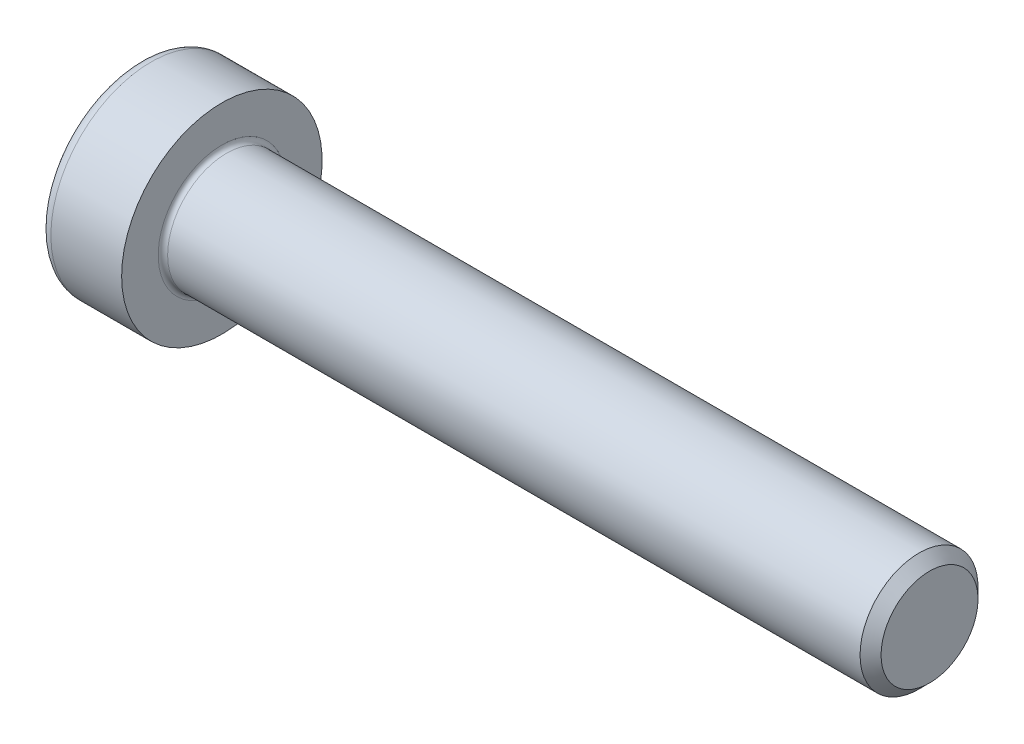
ISO-10303-21;
HEADER;
FILE_DESCRIPTION(('STEP AP214'),'2;1');
FILE_NAME('part.step','',(''),(''),'','','');
FILE_SCHEMA(('AUTOMOTIVE_DESIGN { 1 0 10303 214 1 1 1 1 }'));
ENDSEC;
DATA;
#1=APPLICATION_CONTEXT('core data for automotive mechanical design processes');
#2=APPLICATION_PROTOCOL_DEFINITION('international standard','automotive_design',2000,#1);
#3=PRODUCT_CONTEXT('',#1,'mechanical');
#4=PRODUCT('Part','Part','',(#3));
#5=PRODUCT_RELATED_PRODUCT_CATEGORY('part','',(#4));
#6=PRODUCT_DEFINITION_FORMATION('','',#4);
#7=PRODUCT_DEFINITION_CONTEXT('part definition',#1,'design');
#8=PRODUCT_DEFINITION('design','',#6,#7);
#9=PRODUCT_DEFINITION_SHAPE('','',#8);
#10=(LENGTH_UNIT() NAMED_UNIT(*) SI_UNIT(.MILLI.,.METRE.));
#11=(NAMED_UNIT(*) PLANE_ANGLE_UNIT() SI_UNIT($,.RADIAN.));
#12=(NAMED_UNIT(*) SI_UNIT($,.STERADIAN.) SOLID_ANGLE_UNIT());
#13=UNCERTAINTY_MEASURE_WITH_UNIT(LENGTH_MEASURE(1.E-05),#10,'distance_accuracy_value','');
#14=(GEOMETRIC_REPRESENTATION_CONTEXT(3) GLOBAL_UNCERTAINTY_ASSIGNED_CONTEXT((#13)) GLOBAL_UNIT_ASSIGNED_CONTEXT((#10,
#11,#12)) REPRESENTATION_CONTEXT('',''));
#15=CARTESIAN_POINT('',(0.,0.,0.));
#16=DIRECTION('',(0.,0.,1.));
#17=DIRECTION('',(1.,0.,0.));
#18=AXIS2_PLACEMENT_3D('',#15,#16,#17);
#19=CARTESIAN_POINT('',(2.,3.46410161513776,-2.00000000000001));
#20=DIRECTION('',(1.,0.,0.));
#21=DIRECTION('',(0.,0.,-1.));
#22=AXIS2_PLACEMENT_3D('',#19,#20,#21);
#23=PLANE('',#22);
#24=DIRECTION('',(0.,-1.,0.));
#25=VECTOR('',#24,1.);
#26=CARTESIAN_POINT('',(2.,1.15470053837926,-2.00000000000001));
#27=LINE('',#26,#25);
#28=CARTESIAN_POINT('',(2.,1.15470053837926,-2.00000000000001));
#29=VERTEX_POINT('',#28);
#30=CARTESIAN_POINT('',(2.,0.,-2.00000000000001));
#31=VERTEX_POINT('',#30);
#32=EDGE_CURVE('E140',#29,#31,#27,.T.);
#33=ORIENTED_EDGE('',*,*,#32,.T.);
#34=CARTESIAN_POINT('',(2.,0.,0.));
#35=DIRECTION('',(1.,0.,0.));
#36=DIRECTION('',(0.,0.,-1.));
#37=AXIS2_PLACEMENT_3D('',#34,#35,#36);
#38=CIRCLE('',#37,2.);
#39=CARTESIAN_POINT('',(2.,1.73205080756888,-1.));
#40=VERTEX_POINT('',#39);
#41=EDGE_CURVE('E11',#31,#40,#38,.T.);
#42=ORIENTED_EDGE('',*,*,#41,.T.);
#43=DIRECTION('',(0.,-0.500000000000001,-0.866025403784438));
#44=VECTOR('',#43,1.);
#45=CARTESIAN_POINT('',(2.,2.30940107675851,0.));
#46=LINE('',#45,#44);
#47=EDGE_CURVE('E143',#40,#29,#46,.T.);
#48=ORIENTED_EDGE('',*,*,#47,.T.);
#49=EDGE_LOOP('',(#33,#42,#48));
#50=FACE_BOUND('',#49,.T.);
#51=ADVANCED_FACE('F36',(#50),#23,.F.);
#52=CARTESIAN_POINT('',(2.,2.30940107675851,0.));
#53=VERTEX_POINT('',#52);
#54=EDGE_CURVE('E144',#53,#40,#46,.T.);
#55=ORIENTED_EDGE('',*,*,#54,.T.);
#56=CARTESIAN_POINT('',(2.,1.73205080756888,0.999999999999996));
#57=VERTEX_POINT('',#56);
#58=EDGE_CURVE('E45',#40,#57,#38,.T.);
#59=ORIENTED_EDGE('',*,*,#58,.T.);
#60=DIRECTION('',(0.,-0.499999999999998,0.86602540378444));
#61=VECTOR('',#60,1.);
#62=CARTESIAN_POINT('',(2.,2.30940107675851,0.));
#63=LINE('',#62,#61);
#64=EDGE_CURVE('E123',#53,#57,#63,.T.);
#65=ORIENTED_EDGE('',*,*,#64,.F.);
#66=EDGE_LOOP('',(#55,#59,#65));
#67=FACE_BOUND('',#66,.T.);
#68=ADVANCED_FACE('F213',(#67),#23,.F.);
#69=CARTESIAN_POINT('',(2.,1.15470053837926,1.99999999999999));
#70=VERTEX_POINT('',#69);
#71=EDGE_CURVE('E127',#57,#70,#63,.T.);
#72=ORIENTED_EDGE('',*,*,#71,.F.);
#73=CARTESIAN_POINT('',(2.,0.,0.));
#74=DIRECTION('',(-1.,0.,0.));
#75=DIRECTION('',(0.,0.,1.));
#76=AXIS2_PLACEMENT_3D('',#73,#74,#75);
#77=CIRCLE('',#76,2.);
#78=CARTESIAN_POINT('',(2.,0.,2.));
#79=VERTEX_POINT('',#78);
#80=EDGE_CURVE('E119',#79,#57,#77,.T.);
#81=ORIENTED_EDGE('',*,*,#80,.F.);
#82=DIRECTION('',(0.,1.,0.));
#83=VECTOR('',#82,1.);
#84=CARTESIAN_POINT('',(2.,-1.15470053837924,2.));
#85=LINE('',#84,#83);
#86=EDGE_CURVE('E126',#79,#70,#85,.T.);
#87=ORIENTED_EDGE('',*,*,#86,.T.);
#88=EDGE_LOOP('',(#72,#81,#87));
#89=FACE_BOUND('',#88,.T.);
#90=ADVANCED_FACE('F218',(#89),#23,.F.);
#91=CARTESIAN_POINT('',(2.,-1.15470053837924,2.));
#92=VERTEX_POINT('',#91);
#93=EDGE_CURVE('E128',#92,#79,#85,.T.);
#94=ORIENTED_EDGE('',*,*,#93,.T.);
#95=CARTESIAN_POINT('',(2.,-1.73205080756888,1.));
#96=VERTEX_POINT('',#95);
#97=EDGE_CURVE('E202',#79,#96,#38,.T.);
#98=ORIENTED_EDGE('',*,*,#97,.T.);
#99=DIRECTION('',(0.,-0.500000000000001,-0.866025403784438));
#100=VECTOR('',#99,1.);
#101=CARTESIAN_POINT('',(2.,-1.15470053837924,2.));
#102=LINE('',#101,#100);
#103=EDGE_CURVE('E132',#92,#96,#102,.T.);
#104=ORIENTED_EDGE('',*,*,#103,.F.);
#105=EDGE_LOOP('',(#94,#98,#104));
#106=FACE_BOUND('',#105,.T.);
#107=ADVANCED_FACE('F257',(#106),#23,.F.);
#108=CARTESIAN_POINT('',(2.,-2.30940107675849,0.));
#109=VERTEX_POINT('',#108);
#110=EDGE_CURVE('E131',#96,#109,#102,.T.);
#111=ORIENTED_EDGE('',*,*,#110,.F.);
#112=CARTESIAN_POINT('',(2.,-1.73205080756888,-0.999999999999996));
#113=VERTEX_POINT('',#112);
#114=EDGE_CURVE('E196',#96,#113,#38,.T.);
#115=ORIENTED_EDGE('',*,*,#114,.T.);
#116=DIRECTION('',(0.,0.499999999999998,-0.86602540378444));
#117=VECTOR('',#116,1.);
#118=CARTESIAN_POINT('',(2.,-2.30940107675849,0.));
#119=LINE('',#118,#117);
#120=EDGE_CURVE('E136',#109,#113,#119,.T.);
#121=ORIENTED_EDGE('',*,*,#120,.F.);
#122=EDGE_LOOP('',(#111,#115,#121));
#123=FACE_BOUND('',#122,.T.);
#124=ADVANCED_FACE('F250',(#123),#23,.F.);
#125=CARTESIAN_POINT('',(0.,0.,0.));
#126=DIRECTION('',(-1.,0.,0.));
#127=DIRECTION('',(0.,0.,1.));
#128=AXIS2_PLACEMENT_3D('',#125,#126,#127);
#129=PLANE('',#128);
#130=CARTESIAN_POINT('',(0.,0.,0.));
#131=DIRECTION('',(-1.,0.,0.));
#132=DIRECTION('',(0.,0.,1.));
#133=AXIS2_PLACEMENT_3D('',#130,#131,#132);
#134=CIRCLE('',#133,3.75);
#135=CARTESIAN_POINT('',(0.,0.,3.75));
#136=VERTEX_POINT('',#135);
#137=EDGE_CURVE('E190',#136,#136,#134,.T.);
#138=ORIENTED_EDGE('',*,*,#137,.T.);
#139=EDGE_LOOP('',(#138));
#140=FACE_BOUND('',#139,.T.);
#141=DIRECTION('',(0.,-0.500000000000001,-0.866025403784438));
#142=VECTOR('',#141,1.);
#143=CARTESIAN_POINT('',(0.,2.30940107675851,0.));
#144=LINE('',#143,#142);
#145=CARTESIAN_POINT('',(0.,2.30940107675851,0.));
#146=VERTEX_POINT('',#145);
#147=CARTESIAN_POINT('',(0.,1.15470053837926,-2.00000000000001));
#148=VERTEX_POINT('',#147);
#149=EDGE_CURVE('E159',#146,#148,#144,.T.);
#150=ORIENTED_EDGE('',*,*,#149,.F.);
#151=DIRECTION('',(0.,-0.499999999999998,0.86602540378444));
#152=VECTOR('',#151,1.);
#153=CARTESIAN_POINT('',(0.,2.30940107675851,0.));
#154=LINE('',#153,#152);
#155=CARTESIAN_POINT('',(0.,1.15470053837926,1.99999999999999));
#156=VERTEX_POINT('',#155);
#157=EDGE_CURVE('E58',#146,#156,#154,.T.);
#158=ORIENTED_EDGE('',*,*,#157,.T.);
#159=DIRECTION('',(0.,1.,0.));
#160=VECTOR('',#159,1.);
#161=CARTESIAN_POINT('',(0.,-1.15470053837924,2.));
#162=LINE('',#161,#160);
#163=CARTESIAN_POINT('',(0.,-1.15470053837924,2.));
#164=VERTEX_POINT('',#163);
#165=EDGE_CURVE('E149',#164,#156,#162,.T.);
#166=ORIENTED_EDGE('',*,*,#165,.F.);
#167=DIRECTION('',(0.,-0.500000000000001,-0.866025403784438));
#168=VECTOR('',#167,1.);
#169=CARTESIAN_POINT('',(0.,-1.15470053837924,2.));
#170=LINE('',#169,#168);
#171=CARTESIAN_POINT('',(0.,-2.30940107675849,0.));
#172=VERTEX_POINT('',#171);
#173=EDGE_CURVE('E152',#164,#172,#170,.T.);
#174=ORIENTED_EDGE('',*,*,#173,.T.);
#175=DIRECTION('',(0.,0.499999999999998,-0.86602540378444));
#176=VECTOR('',#175,1.);
#177=CARTESIAN_POINT('',(0.,-2.30940107675849,0.));
#178=LINE('',#177,#176);
#179=CARTESIAN_POINT('',(0.,-1.15470053837925,-2.));
#180=VERTEX_POINT('',#179);
#181=EDGE_CURVE('E154',#172,#180,#178,.T.);
#182=ORIENTED_EDGE('',*,*,#181,.T.);
#183=DIRECTION('',(0.,-1.,0.));
#184=VECTOR('',#183,1.);
#185=CARTESIAN_POINT('',(0.,1.15470053837926,-2.00000000000001));
#186=LINE('',#185,#184);
#187=EDGE_CURVE('E156',#148,#180,#186,.T.);
#188=ORIENTED_EDGE('',*,*,#187,.F.);
#189=EDGE_LOOP('',(#150,#158,#166,#174,#182,#188));
#190=FACE_BOUND('',#189,.T.);
#191=ADVANCED_FACE('F229',(#140,#190),#129,.T.);
#192=CARTESIAN_POINT('',(-31.75,0.,0.));
#193=DIRECTION('',(-1.,0.,0.));
#194=DIRECTION('',(0.,0.,1.));
#195=AXIS2_PLACEMENT_3D('',#192,#193,#194);
#196=CYLINDRICAL_SURFACE('',#195,4.25);
#197=CARTESIAN_POINT('',(0.5,0.,0.));
#198=DIRECTION('',(-1.,0.,0.));
#199=DIRECTION('',(0.,0.,1.));
#200=AXIS2_PLACEMENT_3D('',#197,#198,#199);
#201=CIRCLE('',#200,4.25);
#202=CARTESIAN_POINT('',(0.5,0.,4.25));
#203=VERTEX_POINT('',#202);
#204=EDGE_CURVE('E192',#203,#203,#201,.F.);
#205=ORIENTED_EDGE('',*,*,#204,.T.);
#206=EDGE_LOOP('',(#205));
#207=FACE_BOUND('',#206,.T.);
#208=CARTESIAN_POINT('',(3.5,0.,0.));
#209=DIRECTION('',(-1.,0.,0.));
#210=DIRECTION('',(0.,0.,1.));
#211=AXIS2_PLACEMENT_3D('',#208,#209,#210);
#212=CIRCLE('',#211,4.25);
#213=CARTESIAN_POINT('',(3.5,0.,4.25));
#214=VERTEX_POINT('',#213);
#215=EDGE_CURVE('E181',#214,#214,#212,.T.);
#216=ORIENTED_EDGE('',*,*,#215,.T.);
#217=EDGE_LOOP('',(#216));
#218=FACE_BOUND('',#217,.T.);
#219=ADVANCED_FACE('F262',(#207,#218),#196,.T.);
#220=CARTESIAN_POINT('',(3.5,4.25,0.));
#221=DIRECTION('',(1.,0.,0.));
#222=DIRECTION('',(0.,0.,-1.));
#223=AXIS2_PLACEMENT_3D('',#220,#221,#222);
#224=PLANE('',#223);
#225=CARTESIAN_POINT('',(3.5,0.,0.));
#226=DIRECTION('',(1.,0.,0.));
#227=DIRECTION('',(0.,0.,-1.));
#228=AXIS2_PLACEMENT_3D('',#225,#226,#227);
#229=CIRCLE('',#228,2.69999999999999);
#230=CARTESIAN_POINT('',(3.5,0.,-2.69999999999999));
#231=VERTEX_POINT('',#230);
#232=EDGE_CURVE('E184',#231,#231,#229,.F.);
#233=ORIENTED_EDGE('',*,*,#232,.T.);
#234=EDGE_LOOP('',(#233));
#235=FACE_BOUND('',#234,.T.);
#236=ORIENTED_EDGE('',*,*,#215,.F.);
#237=EDGE_LOOP('',(#236));
#238=FACE_BOUND('',#237,.T.);
#239=ADVANCED_FACE('F293',(#235,#238),#224,.T.);
#240=CARTESIAN_POINT('',(-31.75,0.,0.));
#241=DIRECTION('',(-1.,0.,0.));
#242=DIRECTION('',(0.,0.,1.));
#243=AXIS2_PLACEMENT_3D('',#240,#241,#242);
#244=CYLINDRICAL_SURFACE('',#243,2.49999999999999);
#245=CARTESIAN_POINT('',(3.7,0.,0.));
#246=DIRECTION('',(1.,0.,0.));
#247=DIRECTION('',(0.,0.,-1.));
#248=AXIS2_PLACEMENT_3D('',#245,#246,#247);
#249=CIRCLE('',#248,2.49999999999999);
#250=CARTESIAN_POINT('',(3.7,0.,-2.49999999999999));
#251=VERTEX_POINT('',#250);
#252=EDGE_CURVE('E187',#251,#251,#249,.T.);
#253=ORIENTED_EDGE('',*,*,#252,.T.);
#254=EDGE_LOOP('',(#253));
#255=FACE_BOUND('',#254,.T.);
#256=CARTESIAN_POINT('',(33.055,0.,0.));
#257=DIRECTION('',(-1.,0.,0.));
#258=DIRECTION('',(0.,0.,1.));
#259=AXIS2_PLACEMENT_3D('',#256,#257,#258);
#260=CIRCLE('',#259,2.49999999999999);
#261=CARTESIAN_POINT('',(33.055,0.,2.49999999999999));
#262=VERTEX_POINT('',#261);
#263=EDGE_CURVE('E178',#262,#262,#260,.T.);
#264=ORIENTED_EDGE('',*,*,#263,.T.);
#265=EDGE_LOOP('',(#264));
#266=FACE_BOUND('',#265,.T.);
#267=ADVANCED_FACE('F289',(#255,#266),#244,.T.);
#268=CARTESIAN_POINT('',(33.5,0.,0.));
#269=DIRECTION('',(-1.,0.,0.));
#270=DIRECTION('',(0.,0.,1.));
#271=AXIS2_PLACEMENT_3D('',#268,#269,#270);
#272=CONICAL_SURFACE('',#271,2.055,0.785398163397417);
#273=ORIENTED_EDGE('',*,*,#263,.F.);
#274=EDGE_LOOP('',(#273));
#275=FACE_BOUND('',#274,.T.);
#276=CARTESIAN_POINT('',(33.5,0.,0.));
#277=DIRECTION('',(-1.,0.,0.));
#278=DIRECTION('',(0.,0.,1.));
#279=AXIS2_PLACEMENT_3D('',#276,#277,#278);
#280=CIRCLE('',#279,2.055);
#281=CARTESIAN_POINT('',(33.5,0.,2.055));
#282=VERTEX_POINT('',#281);
#283=EDGE_CURVE('E175',#282,#282,#280,.T.);
#284=ORIENTED_EDGE('',*,*,#283,.T.);
#285=EDGE_LOOP('',(#284));
#286=FACE_BOUND('',#285,.T.);
#287=ADVANCED_FACE('F285',(#275,#286),#272,.T.);
#288=CARTESIAN_POINT('',(33.5,2.055,0.));
#289=DIRECTION('',(1.,0.,0.));
#290=DIRECTION('',(0.,0.,-1.));
#291=AXIS2_PLACEMENT_3D('',#288,#289,#290);
#292=PLANE('',#291);
#293=ORIENTED_EDGE('',*,*,#283,.F.);
#294=EDGE_LOOP('',(#293));
#295=FACE_BOUND('',#294,.T.);
#296=ADVANCED_FACE('F281',(#295),#292,.T.);
#297=CARTESIAN_POINT('',(3.7,0.,0.));
#298=DIRECTION('',(1.,0.,0.));
#299=DIRECTION('',(0.,0.,-1.));
#300=AXIS2_PLACEMENT_3D('',#297,#298,#299);
#301=TOROIDAL_SURFACE('',#300,2.69999999999999,0.2);
#302=ORIENTED_EDGE('',*,*,#252,.F.);
#303=EDGE_LOOP('',(#302));
#304=FACE_BOUND('',#303,.T.);
#305=ORIENTED_EDGE('',*,*,#232,.F.);
#306=EDGE_LOOP('',(#305));
#307=FACE_BOUND('',#306,.T.);
#308=ADVANCED_FACE('F284',(#304,#307),#301,.F.);
#309=CARTESIAN_POINT('',(0.5,0.,0.));
#310=DIRECTION('',(-1.,0.,0.));
#311=DIRECTION('',(0.,0.,1.));
#312=AXIS2_PLACEMENT_3D('',#309,#310,#311);
#313=TOROIDAL_SURFACE('',#312,3.75,0.5);
#314=ORIENTED_EDGE('',*,*,#204,.F.);
#315=EDGE_LOOP('',(#314));
#316=FACE_BOUND('',#315,.T.);
#317=ORIENTED_EDGE('',*,*,#137,.F.);
#318=EDGE_LOOP('',(#317));
#319=FACE_BOUND('',#318,.T.);
#320=ADVANCED_FACE('F38',(#316,#319),#313,.T.);
#321=CARTESIAN_POINT('',(2.,2.30940107675851,0.));
#322=DIRECTION('',(0.,-0.86602540378444,-0.499999999999998));
#323=DIRECTION('',(0.,0.499999999999998,-0.86602540378444));
#324=AXIS2_PLACEMENT_3D('',#321,#322,#323);
#325=PLANE('',#324);
#326=DIRECTION('',(-1.,0.,0.));
#327=VECTOR('',#326,1.);
#328=CARTESIAN_POINT('',(2.,1.15470053837926,1.99999999999999));
#329=LINE('',#328,#327);
#330=EDGE_CURVE('E173',#70,#156,#329,.T.);
#331=ORIENTED_EDGE('',*,*,#330,.T.);
#332=ORIENTED_EDGE('',*,*,#157,.F.);
#333=DIRECTION('',(-1.,0.,0.));
#334=VECTOR('',#333,1.);
#335=CARTESIAN_POINT('',(2.,2.30940107675851,0.));
#336=LINE('',#335,#334);
#337=EDGE_CURVE('E147',#53,#146,#336,.T.);
#338=ORIENTED_EDGE('',*,*,#337,.F.);
#339=ORIENTED_EDGE('',*,*,#64,.T.);
#340=ORIENTED_EDGE('',*,*,#71,.T.);
#341=EDGE_LOOP('',(#331,#332,#338,#339,#340));
#342=FACE_BOUND('',#341,.T.);
#343=ADVANCED_FACE('F221',(#342),#325,.T.);
#344=CARTESIAN_POINT('',(2.,-1.15470053837924,2.));
#345=DIRECTION('',(0.,0.,1.));
#346=DIRECTION('',(0.,-1.,0.));
#347=AXIS2_PLACEMENT_3D('',#344,#345,#346);
#348=PLANE('',#347);
#349=ORIENTED_EDGE('',*,*,#86,.F.);
#350=ORIENTED_EDGE('',*,*,#93,.F.);
#351=DIRECTION('',(-1.,0.,0.));
#352=VECTOR('',#351,1.);
#353=CARTESIAN_POINT('',(2.,-1.15470053837924,2.));
#354=LINE('',#353,#352);
#355=EDGE_CURVE('E171',#92,#164,#354,.T.);
#356=ORIENTED_EDGE('',*,*,#355,.T.);
#357=ORIENTED_EDGE('',*,*,#165,.T.);
#358=ORIENTED_EDGE('',*,*,#330,.F.);
#359=EDGE_LOOP('',(#349,#350,#356,#357,#358));
#360=FACE_BOUND('',#359,.T.);
#361=ADVANCED_FACE('F270',(#360),#348,.F.);
#362=CARTESIAN_POINT('',(2.,-1.15470053837924,2.));
#363=DIRECTION('',(0.,0.866025403784438,-0.500000000000001));
#364=DIRECTION('',(0.,0.500000000000001,0.866025403784438));
#365=AXIS2_PLACEMENT_3D('',#362,#363,#364);
#366=PLANE('',#365);
#367=DIRECTION('',(-1.,0.,0.));
#368=VECTOR('',#367,1.);
#369=CARTESIAN_POINT('',(2.,-2.30940107675849,0.));
#370=LINE('',#369,#368);
#371=EDGE_CURVE('E168',#109,#172,#370,.T.);
#372=ORIENTED_EDGE('',*,*,#371,.T.);
#373=ORIENTED_EDGE('',*,*,#173,.F.);
#374=ORIENTED_EDGE('',*,*,#355,.F.);
#375=ORIENTED_EDGE('',*,*,#103,.T.);
#376=ORIENTED_EDGE('',*,*,#110,.T.);
#377=EDGE_LOOP('',(#372,#373,#374,#375,#376));
#378=FACE_BOUND('',#377,.T.);
#379=ADVANCED_FACE('F266',(#378),#366,.T.);
#380=CARTESIAN_POINT('',(2.,-2.30940107675849,0.));
#381=DIRECTION('',(0.,0.86602540378444,0.499999999999998));
#382=DIRECTION('',(0.,-0.499999999999998,0.86602540378444));
#383=AXIS2_PLACEMENT_3D('',#380,#381,#382);
#384=PLANE('',#383);
#385=DIRECTION('',(-1.,0.,0.));
#386=VECTOR('',#385,1.);
#387=CARTESIAN_POINT('',(2.,-1.15470053837925,-2.));
#388=LINE('',#387,#386);
#389=CARTESIAN_POINT('',(2.,-1.15470053837925,-2.));
#390=VERTEX_POINT('',#389);
#391=EDGE_CURVE('E165',#390,#180,#388,.T.);
#392=ORIENTED_EDGE('',*,*,#391,.T.);
#393=ORIENTED_EDGE('',*,*,#181,.F.);
#394=ORIENTED_EDGE('',*,*,#371,.F.);
#395=ORIENTED_EDGE('',*,*,#120,.T.);
#396=EDGE_CURVE('E135',#113,#390,#119,.T.);
#397=ORIENTED_EDGE('',*,*,#396,.T.);
#398=EDGE_LOOP('',(#392,#393,#394,#395,#397));
#399=FACE_BOUND('',#398,.T.);
#400=ADVANCED_FACE('F237',(#399),#384,.T.);
#401=CARTESIAN_POINT('',(2.,1.15470053837926,-2.00000000000001));
#402=DIRECTION('',(0.,0.,-1.));
#403=DIRECTION('',(0.,1.,0.));
#404=AXIS2_PLACEMENT_3D('',#401,#402,#403);
#405=PLANE('',#404);
#406=EDGE_CURVE('E139',#31,#390,#27,.T.);
#407=ORIENTED_EDGE('',*,*,#406,.F.);
#408=ORIENTED_EDGE('',*,*,#32,.F.);
#409=DIRECTION('',(-1.,0.,0.));
#410=VECTOR('',#409,1.);
#411=CARTESIAN_POINT('',(2.,1.15470053837926,-2.00000000000001));
#412=LINE('',#411,#410);
#413=EDGE_CURVE('E162',#29,#148,#412,.T.);
#414=ORIENTED_EDGE('',*,*,#413,.T.);
#415=ORIENTED_EDGE('',*,*,#187,.T.);
#416=ORIENTED_EDGE('',*,*,#391,.F.);
#417=EDGE_LOOP('',(#407,#408,#414,#415,#416));
#418=FACE_BOUND('',#417,.T.);
#419=ADVANCED_FACE('F234',(#418),#405,.F.);
#420=CARTESIAN_POINT('',(2.,2.30940107675851,0.));
#421=DIRECTION('',(0.,0.866025403784438,-0.500000000000001));
#422=DIRECTION('',(0.,0.500000000000001,0.866025403784438));
#423=AXIS2_PLACEMENT_3D('',#420,#421,#422);
#424=PLANE('',#423);
#425=ORIENTED_EDGE('',*,*,#47,.F.);
#426=ORIENTED_EDGE('',*,*,#54,.F.);
#427=ORIENTED_EDGE('',*,*,#337,.T.);
#428=ORIENTED_EDGE('',*,*,#149,.T.);
#429=ORIENTED_EDGE('',*,*,#413,.F.);
#430=EDGE_LOOP('',(#425,#426,#427,#428,#429));
#431=FACE_BOUND('',#430,.T.);
#432=ADVANCED_FACE('F225',(#431),#424,.F.);
#433=ORIENTED_EDGE('',*,*,#396,.F.);
#434=EDGE_CURVE('E40',#113,#31,#38,.T.);
#435=ORIENTED_EDGE('',*,*,#434,.T.);
#436=ORIENTED_EDGE('',*,*,#406,.T.);
#437=EDGE_LOOP('',(#433,#435,#436));
#438=FACE_BOUND('',#437,.T.);
#439=ADVANCED_FACE('F239',(#438),#23,.F.);
#440=CARTESIAN_POINT('',(2.,0.,0.));
#441=DIRECTION('',(-1.,0.,0.));
#442=DIRECTION('',(0.,0.,1.));
#443=AXIS2_PLACEMENT_3D('',#440,#441,#442);
#444=CONICAL_SURFACE('',#443,2.,1.04719755119659);
#445=CARTESIAN_POINT('',(2.43301270189222,0.,0.));
#446=DIRECTION('',(-1.,0.,0.));
#447=DIRECTION('',(0.,0.,1.));
#448=AXIS2_PLACEMENT_3D('',#445,#446,#447);
#449=CIRCLE('',#448,1.25);
#450=CARTESIAN_POINT('',(2.43301270189222,0.,1.25));
#451=VERTEX_POINT('',#450);
#452=EDGE_CURVE('E116',#451,#451,#449,.T.);
#453=ORIENTED_EDGE('',*,*,#452,.F.);
#454=EDGE_LOOP('',(#453));
#455=FACE_BOUND('',#454,.T.);
#456=ORIENTED_EDGE('',*,*,#80,.T.);
#457=ORIENTED_EDGE('',*,*,#58,.F.);
#458=ORIENTED_EDGE('',*,*,#41,.F.);
#459=ORIENTED_EDGE('',*,*,#434,.F.);
#460=ORIENTED_EDGE('',*,*,#114,.F.);
#461=ORIENTED_EDGE('',*,*,#97,.F.);
#462=EDGE_LOOP('',(#456,#457,#458,#459,#460,#461));
#463=FACE_BOUND('',#462,.T.);
#464=ADVANCED_FACE('F249',(#455,#463),#444,.F.);
#465=CARTESIAN_POINT('',(0.,0.,0.));
#466=DIRECTION('',(-1.,0.,0.));
#467=DIRECTION('',(0.,0.,1.));
#468=AXIS2_PLACEMENT_3D('',#465,#466,#467);
#469=CYLINDRICAL_SURFACE('',#468,1.25);
#470=CARTESIAN_POINT('',(4.,0.,0.));
#471=DIRECTION('',(-1.,0.,0.));
#472=DIRECTION('',(0.,0.,1.));
#473=AXIS2_PLACEMENT_3D('',#470,#471,#472);
#474=CIRCLE('',#473,1.25);
#475=CARTESIAN_POINT('',(4.,0.,1.25));
#476=VERTEX_POINT('',#475);
#477=EDGE_CURVE('E114',#476,#476,#474,.T.);
#478=ORIENTED_EDGE('',*,*,#477,.F.);
#479=EDGE_LOOP('',(#478));
#480=FACE_BOUND('',#479,.T.);
#481=ORIENTED_EDGE('',*,*,#452,.T.);
#482=EDGE_LOOP('',(#481));
#483=FACE_BOUND('',#482,.T.);
#484=ADVANCED_FACE('F110',(#480,#483),#469,.F.);
#485=CARTESIAN_POINT('',(4.,0.,0.));
#486=DIRECTION('',(-1.,0.,0.));
#487=DIRECTION('',(0.,0.,1.));
#488=AXIS2_PLACEMENT_3D('',#485,#486,#487);
#489=CONICAL_SURFACE('',#488,1.25,1.04719755119659);
#490=CARTESIAN_POINT('',(4.72168783648705,0.,0.));
#491=VERTEX_POINT('',#490);
#492=VERTEX_LOOP('',#491);
#493=FACE_BOUND('',#492,.T.);
#494=ORIENTED_EDGE('',*,*,#477,.T.);
#495=EDGE_LOOP('',(#494));
#496=FACE_BOUND('',#495,.T.);
#497=ADVANCED_FACE('F107',(#493,#496),#489,.F.);
#498=CLOSED_SHELL('',(#51,#68,#90,#107,#124,#191,#219,#239,#267,#287,#296,#308,#320,#343,#361,
#379,#400,#419,#432,#439,#464,#484,#497));
#499=MANIFOLD_SOLID_BREP('B2',#498);
#500=ADVANCED_BREP_SHAPE_REPRESENTATION('',(#18,#499),#14);
#501=SHAPE_DEFINITION_REPRESENTATION(#9,#500);
ENDSEC;
END-ISO-10303-21;
